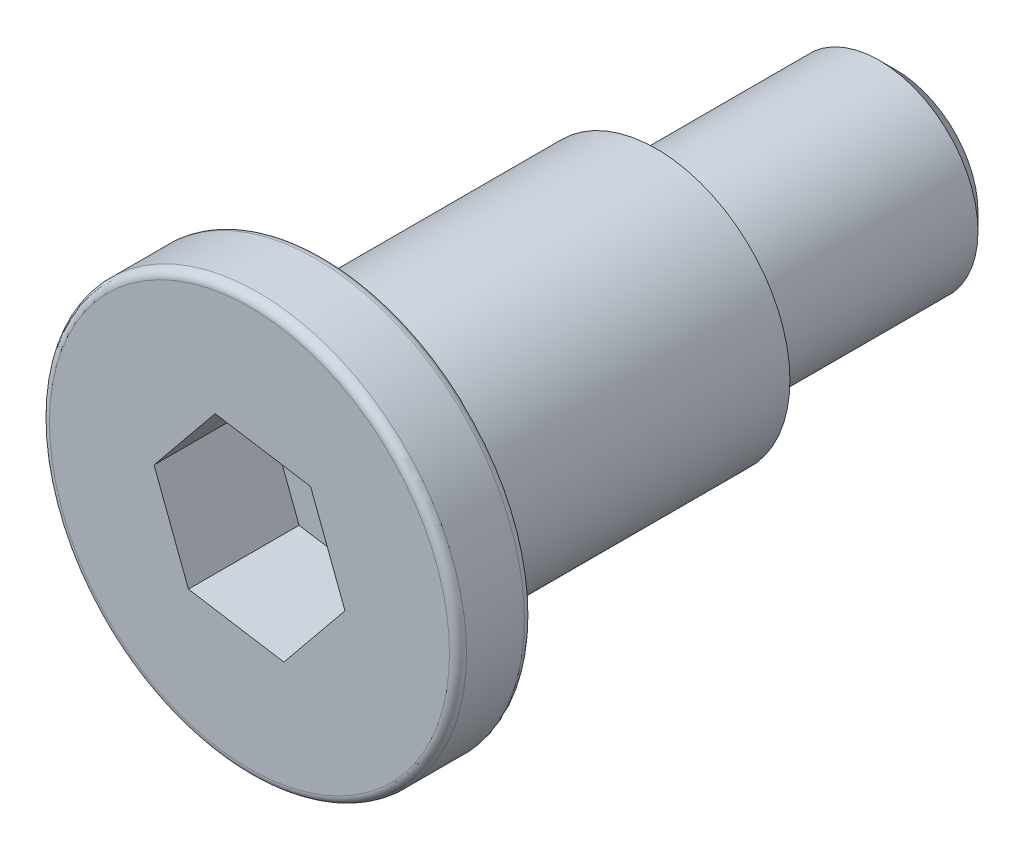
ISO-10303-21;
HEADER;
FILE_DESCRIPTION(('STEP AP214'),'2;1');
FILE_NAME('part.step','',(''),(''),'','','');
FILE_SCHEMA(('AUTOMOTIVE_DESIGN { 1 0 10303 214 1 1 1 1 }'));
ENDSEC;
DATA;
#1=APPLICATION_CONTEXT('core data for automotive mechanical design processes');
#2=APPLICATION_PROTOCOL_DEFINITION('international standard','automotive_design',2000,#1);
#3=PRODUCT_CONTEXT('',#1,'mechanical');
#4=PRODUCT('Part','Part','',(#3));
#5=PRODUCT_RELATED_PRODUCT_CATEGORY('part','',(#4));
#6=PRODUCT_DEFINITION_FORMATION('','',#4);
#7=PRODUCT_DEFINITION_CONTEXT('part definition',#1,'design');
#8=PRODUCT_DEFINITION('design','',#6,#7);
#9=PRODUCT_DEFINITION_SHAPE('','',#8);
#10=(LENGTH_UNIT() NAMED_UNIT(*) SI_UNIT(.MILLI.,.METRE.));
#11=(NAMED_UNIT(*) PLANE_ANGLE_UNIT() SI_UNIT($,.RADIAN.));
#12=(NAMED_UNIT(*) SI_UNIT($,.STERADIAN.) SOLID_ANGLE_UNIT());
#13=UNCERTAINTY_MEASURE_WITH_UNIT(LENGTH_MEASURE(1.E-05),#10,'distance_accuracy_value','');
#14=(GEOMETRIC_REPRESENTATION_CONTEXT(3) GLOBAL_UNCERTAINTY_ASSIGNED_CONTEXT((#13)) GLOBAL_UNIT_ASSIGNED_CONTEXT((#10,
#11,#12)) REPRESENTATION_CONTEXT('',''));
#15=CARTESIAN_POINT('',(0.,0.,0.));
#16=DIRECTION('',(0.,0.,1.));
#17=DIRECTION('',(1.,0.,0.));
#18=AXIS2_PLACEMENT_3D('',#15,#16,#17);
#19=CARTESIAN_POINT('',(0.,1.8669,-1.52591292247407));
#20=DIRECTION('',(0.,0.,-1.));
#21=DIRECTION('',(-1.,0.,0.));
#22=AXIS2_PLACEMENT_3D('',#19,#20,#21);
#23=PLANE('',#22);
#24=CARTESIAN_POINT('',(0.,0.,-1.52591292247407));
#25=DIRECTION('',(0.,0.,-1.));
#26=DIRECTION('',(-1.,0.,0.));
#27=AXIS2_PLACEMENT_3D('',#24,#25,#26);
#28=CIRCLE('',#27,1.7907);
#29=CARTESIAN_POINT('',(-1.7907,0.,-1.52591292247407));
#30=VERTEX_POINT('',#29);
#31=EDGE_CURVE('E160',#30,#30,#28,.F.);
#32=ORIENTED_EDGE('',*,*,#31,.T.);
#33=EDGE_LOOP('',(#32));
#34=FACE_BOUND('',#33,.T.);
#35=DIRECTION('',(0.987209666941548,-0.159427329831364,0.));
#36=VECTOR('',#35,1.);
#37=CARTESIAN_POINT('',(-0.546904779115422,-0.671201319823438,-1.52591292247407));
#38=LINE('',#37,#36);
#39=CARTESIAN_POINT('',(-0.546904779115422,-0.671201319823437,-1.52591292247407));
#40=VERTEX_POINT('',#39);
#41=CARTESIAN_POINT('',(0.30782500446303,-0.809234092076791,-1.52591292247407));
#42=VERTEX_POINT('',#41);
#43=EDGE_CURVE('E124',#40,#42,#38,.T.);
#44=ORIENTED_EDGE('',*,*,#43,.F.);
#45=DIRECTION('',(0.355536715779292,-0.934662315348637,0.));
#46=VECTOR('',#45,1.);
#47=CARTESIAN_POINT('',(-0.854729783578451,0.138032772253354,-1.52591292247407));
#48=LINE('',#47,#46);
#49=CARTESIAN_POINT('',(-0.854729783578451,0.138032772253354,-1.52591292247407));
#50=VERTEX_POINT('',#49);
#51=EDGE_CURVE('E50',#50,#40,#48,.T.);
#52=ORIENTED_EDGE('',*,*,#51,.F.);
#53=DIRECTION('',(-0.631672951162255,-0.775234985517273,0.));
#54=VECTOR('',#53,1.);
#55=CARTESIAN_POINT('',(-0.30782500446303,0.809234092076791,-1.52591292247407));
#56=LINE('',#55,#54);
#57=CARTESIAN_POINT('',(-0.30782500446303,0.809234092076791,-1.52591292247407));
#58=VERTEX_POINT('',#57);
#59=EDGE_CURVE('E133',#58,#50,#56,.T.);
#60=ORIENTED_EDGE('',*,*,#59,.F.);
#61=DIRECTION('',(-0.987209666941548,0.159427329831364,0.));
#62=VECTOR('',#61,1.);
#63=CARTESIAN_POINT('',(0.546904779115422,0.671201319823438,-1.52591292247407));
#64=LINE('',#63,#62);
#65=CARTESIAN_POINT('',(0.546904779115422,0.671201319823438,-1.52591292247407));
#66=VERTEX_POINT('',#65);
#67=EDGE_CURVE('E131',#66,#58,#64,.T.);
#68=ORIENTED_EDGE('',*,*,#67,.F.);
#69=DIRECTION('',(-0.355536715779292,0.934662315348637,0.));
#70=VECTOR('',#69,1.);
#71=CARTESIAN_POINT('',(0.854729783578452,-0.138032772253354,-1.52591292247407));
#72=LINE('',#71,#70);
#73=CARTESIAN_POINT('',(0.854729783578452,-0.138032772253354,-1.52591292247407));
#74=VERTEX_POINT('',#73);
#75=EDGE_CURVE('E98',#74,#66,#72,.T.);
#76=ORIENTED_EDGE('',*,*,#75,.F.);
#77=DIRECTION('',(0.631672951162256,0.775234985517273,0.));
#78=VECTOR('',#77,1.);
#79=CARTESIAN_POINT('',(0.30782500446303,-0.809234092076791,-1.52591292247407));
#80=LINE('',#79,#78);
#81=EDGE_CURVE('E127',#42,#74,#80,.T.);
#82=ORIENTED_EDGE('',*,*,#81,.F.);
#83=EDGE_LOOP('',(#44,#52,#60,#68,#76,#82));
#84=FACE_BOUND('',#83,.T.);
#85=ADVANCED_FACE('F35',(#34,#84),#23,.F.);
#86=CARTESIAN_POINT('',(0.,0.,-7.31711292247407));
#87=DIRECTION('',(0.,0.,1.));
#88=DIRECTION('',(1.,0.,0.));
#89=AXIS2_PLACEMENT_3D('',#86,#87,#88);
#90=PLANE('',#89);
#91=CARTESIAN_POINT('',(0.,0.,-7.31711292247407));
#92=DIRECTION('',(0.,0.,1.));
#93=DIRECTION('',(1.,0.,0.));
#94=AXIS2_PLACEMENT_3D('',#91,#92,#93);
#95=CIRCLE('',#94,0.731519999999999);
#96=CARTESIAN_POINT('',(0.731519999999999,0.,-7.31711292247407));
#97=VERTEX_POINT('',#96);
#98=EDGE_CURVE('E11',#97,#97,#95,.F.);
#99=ORIENTED_EDGE('',*,*,#98,.T.);
#100=EDGE_LOOP('',(#99));
#101=FACE_BOUND('',#100,.T.);
#102=ADVANCED_FACE('F178',(#101),#90,.F.);
#103=CARTESIAN_POINT('',(0.,0.,-1.52591292247407));
#104=DIRECTION('',(0.,0.,1.));
#105=DIRECTION('',(1.,0.,0.));
#106=AXIS2_PLACEMENT_3D('',#103,#104,#105);
#107=CYLINDRICAL_SURFACE('',#106,0.88392);
#108=CARTESIAN_POINT('',(0.,0.,-7.16471292247407));
#109=DIRECTION('',(0.,0.,1.));
#110=DIRECTION('',(1.,0.,0.));
#111=AXIS2_PLACEMENT_3D('',#108,#109,#110);
#112=CIRCLE('',#111,0.88392);
#113=CARTESIAN_POINT('',(0.88392,0.,-7.16471292247407));
#114=VERTEX_POINT('',#113);
#115=EDGE_CURVE('E43',#114,#114,#112,.T.);
#116=ORIENTED_EDGE('',*,*,#115,.T.);
#117=EDGE_LOOP('',(#116));
#118=FACE_BOUND('',#117,.T.);
#119=CARTESIAN_POINT('',(0.,0.,-5.16827292247407));
#120=DIRECTION('',(0.,0.,1.));
#121=DIRECTION('',(1.,0.,0.));
#122=AXIS2_PLACEMENT_3D('',#119,#120,#121);
#123=CIRCLE('',#122,0.88392);
#124=CARTESIAN_POINT('',(0.88392,0.,-5.16827292247407));
#125=VERTEX_POINT('',#124);
#126=EDGE_CURVE('E148',#125,#125,#123,.T.);
#127=ORIENTED_EDGE('',*,*,#126,.F.);
#128=EDGE_LOOP('',(#127));
#129=FACE_BOUND('',#128,.T.);
#130=ADVANCED_FACE('F165',(#118,#129),#107,.T.);
#131=CARTESIAN_POINT('',(0.,0.88392,-5.16827292247407));
#132=DIRECTION('',(0.,0.,1.));
#133=DIRECTION('',(1.,0.,0.));
#134=AXIS2_PLACEMENT_3D('',#131,#132,#133);
#135=PLANE('',#134);
#136=CARTESIAN_POINT('',(0.,0.,-5.16827292247407));
#137=DIRECTION('',(0.,0.,1.));
#138=DIRECTION('',(1.,0.,0.));
#139=AXIS2_PLACEMENT_3D('',#136,#137,#138);
#140=CIRCLE('',#139,1.19634);
#141=CARTESIAN_POINT('',(1.19634,0.,-5.16827292247407));
#142=VERTEX_POINT('',#141);
#143=EDGE_CURVE('E145',#142,#142,#140,.T.);
#144=ORIENTED_EDGE('',*,*,#143,.F.);
#145=EDGE_LOOP('',(#144));
#146=FACE_BOUND('',#145,.T.);
#147=ORIENTED_EDGE('',*,*,#126,.T.);
#148=EDGE_LOOP('',(#147));
#149=FACE_BOUND('',#148,.T.);
#150=ADVANCED_FACE('F222',(#146,#149),#135,.F.);
#151=CARTESIAN_POINT('',(0.,0.,-1.52591292247407));
#152=DIRECTION('',(0.,0.,1.));
#153=DIRECTION('',(1.,0.,0.));
#154=AXIS2_PLACEMENT_3D('',#151,#152,#153);
#155=CYLINDRICAL_SURFACE('',#154,1.19634);
#156=CARTESIAN_POINT('',(0.,0.,-2.19647292247407));
#157=DIRECTION('',(0.,0.,1.));
#158=DIRECTION('',(1.,0.,0.));
#159=AXIS2_PLACEMENT_3D('',#156,#157,#158);
#160=CIRCLE('',#159,1.19634);
#161=CARTESIAN_POINT('',(1.19634,0.,-2.19647292247407));
#162=VERTEX_POINT('',#161);
#163=EDGE_CURVE('E137',#162,#162,#160,.T.);
#164=ORIENTED_EDGE('',*,*,#163,.F.);
#165=EDGE_LOOP('',(#164));
#166=FACE_BOUND('',#165,.T.);
#167=ORIENTED_EDGE('',*,*,#143,.T.);
#168=EDGE_LOOP('',(#167));
#169=FACE_BOUND('',#168,.T.);
#170=ADVANCED_FACE('F215',(#166,#169),#155,.T.);
#171=CARTESIAN_POINT('',(0.,1.19634,-2.19647292247407));
#172=DIRECTION('',(0.,0.,1.));
#173=DIRECTION('',(1.,0.,0.));
#174=AXIS2_PLACEMENT_3D('',#171,#172,#173);
#175=PLANE('',#174);
#176=CARTESIAN_POINT('',(0.,0.,-2.19647292247407));
#177=DIRECTION('',(0.,0.,1.));
#178=DIRECTION('',(1.,0.,0.));
#179=AXIS2_PLACEMENT_3D('',#176,#177,#178);
#180=CIRCLE('',#179,1.7907);
#181=CARTESIAN_POINT('',(1.7907,0.,-2.19647292247407));
#182=VERTEX_POINT('',#181);
#183=EDGE_CURVE('E157',#182,#182,#180,.F.);
#184=ORIENTED_EDGE('',*,*,#183,.T.);
#185=EDGE_LOOP('',(#184));
#186=FACE_BOUND('',#185,.T.);
#187=ORIENTED_EDGE('',*,*,#163,.T.);
#188=EDGE_LOOP('',(#187));
#189=FACE_BOUND('',#188,.T.);
#190=ADVANCED_FACE('F204',(#186,#189),#175,.F.);
#191=CARTESIAN_POINT('',(0.,0.,-1.52591292247407));
#192=DIRECTION('',(0.,0.,1.));
#193=DIRECTION('',(1.,0.,0.));
#194=AXIS2_PLACEMENT_3D('',#191,#192,#193);
#195=CYLINDRICAL_SURFACE('',#194,1.8669);
#196=CARTESIAN_POINT('',(0.,0.,-2.12027292247407));
#197=DIRECTION('',(0.,0.,1.));
#198=DIRECTION('',(1.,0.,0.));
#199=AXIS2_PLACEMENT_3D('',#196,#197,#198);
#200=CIRCLE('',#199,1.8669);
#201=CARTESIAN_POINT('',(1.8669,0.,-2.12027292247407));
#202=VERTEX_POINT('',#201);
#203=EDGE_CURVE('E154',#202,#202,#200,.T.);
#204=ORIENTED_EDGE('',*,*,#203,.T.);
#205=EDGE_LOOP('',(#204));
#206=FACE_BOUND('',#205,.T.);
#207=CARTESIAN_POINT('',(0.,0.,-1.60211292247407));
#208=DIRECTION('',(0.,0.,-1.));
#209=DIRECTION('',(-1.,0.,0.));
#210=AXIS2_PLACEMENT_3D('',#207,#208,#209);
#211=CIRCLE('',#210,1.8669);
#212=CARTESIAN_POINT('',(-1.8669,0.,-1.60211292247407));
#213=VERTEX_POINT('',#212);
#214=EDGE_CURVE('E151',#213,#213,#211,.T.);
#215=ORIENTED_EDGE('',*,*,#214,.T.);
#216=EDGE_LOOP('',(#215));
#217=FACE_BOUND('',#216,.T.);
#218=ADVANCED_FACE('F200',(#206,#217),#195,.T.);
#219=CARTESIAN_POINT('',(-0.854729783578451,0.138032772253354,-2.51651292247407));
#220=DIRECTION('',(-0.934662315348637,-0.355536715779292,0.));
#221=DIRECTION('',(0.355536715779292,-0.934662315348637,0.));
#222=AXIS2_PLACEMENT_3D('',#219,#220,#221);
#223=PLANE('',#222);
#224=ORIENTED_EDGE('',*,*,#51,.T.);
#225=DIRECTION('',(0.,0.,1.));
#226=VECTOR('',#225,1.);
#227=CARTESIAN_POINT('',(-0.546904779115422,-0.671201319823438,-2.51651292247407));
#228=LINE('',#227,#226);
#229=CARTESIAN_POINT('',(-0.546904779115422,-0.671201319823438,-2.51651292247407));
#230=VERTEX_POINT('',#229);
#231=EDGE_CURVE('E80',#230,#40,#228,.T.);
#232=ORIENTED_EDGE('',*,*,#231,.F.);
#233=DIRECTION('',(0.355536715779292,-0.934662315348637,0.));
#234=VECTOR('',#233,1.);
#235=CARTESIAN_POINT('',(-0.854729783578451,0.138032772253354,-2.51651292247407));
#236=LINE('',#235,#234);
#237=CARTESIAN_POINT('',(-0.854729783578451,0.138032772253354,-2.51651292247407));
#238=VERTEX_POINT('',#237);
#239=EDGE_CURVE('E135',#238,#230,#236,.T.);
#240=ORIENTED_EDGE('',*,*,#239,.F.);
#241=DIRECTION('',(0.,0.,1.));
#242=VECTOR('',#241,1.);
#243=CARTESIAN_POINT('',(-0.854729783578451,0.138032772253354,-2.51651292247407));
#244=LINE('',#243,#242);
#245=EDGE_CURVE('E58',#238,#50,#244,.T.);
#246=ORIENTED_EDGE('',*,*,#245,.T.);
#247=EDGE_LOOP('',(#224,#232,#240,#246));
#248=FACE_BOUND('',#247,.T.);
#249=ADVANCED_FACE('F203',(#248),#223,.F.);
#250=CARTESIAN_POINT('',(-0.30782500446303,0.809234092076791,-2.51651292247407));
#251=DIRECTION('',(-0.775234985517273,0.631672951162255,0.));
#252=DIRECTION('',(-0.631672951162255,-0.775234985517273,0.));
#253=AXIS2_PLACEMENT_3D('',#250,#251,#252);
#254=PLANE('',#253);
#255=ORIENTED_EDGE('',*,*,#59,.T.);
#256=ORIENTED_EDGE('',*,*,#245,.F.);
#257=DIRECTION('',(-0.631672951162255,-0.775234985517273,0.));
#258=VECTOR('',#257,1.);
#259=CARTESIAN_POINT('',(-0.30782500446303,0.809234092076791,-2.51651292247407));
#260=LINE('',#259,#258);
#261=CARTESIAN_POINT('',(-0.30782500446303,0.809234092076791,-2.51651292247407));
#262=VERTEX_POINT('',#261);
#263=EDGE_CURVE('E110',#262,#238,#260,.T.);
#264=ORIENTED_EDGE('',*,*,#263,.F.);
#265=DIRECTION('',(0.,0.,1.));
#266=VECTOR('',#265,1.);
#267=CARTESIAN_POINT('',(-0.30782500446303,0.809234092076791,-2.51651292247407));
#268=LINE('',#267,#266);
#269=EDGE_CURVE('E102',#262,#58,#268,.T.);
#270=ORIENTED_EDGE('',*,*,#269,.T.);
#271=EDGE_LOOP('',(#255,#256,#264,#270));
#272=FACE_BOUND('',#271,.T.);
#273=ADVANCED_FACE('F213',(#272),#254,.F.);
#274=CARTESIAN_POINT('',(0.546904779115422,0.671201319823438,-2.51651292247407));
#275=DIRECTION('',(0.159427329831364,0.987209666941548,0.));
#276=DIRECTION('',(-0.987209666941548,0.159427329831364,0.));
#277=AXIS2_PLACEMENT_3D('',#274,#275,#276);
#278=PLANE('',#277);
#279=ORIENTED_EDGE('',*,*,#67,.T.);
#280=ORIENTED_EDGE('',*,*,#269,.F.);
#281=DIRECTION('',(-0.987209666941548,0.159427329831364,0.));
#282=VECTOR('',#281,1.);
#283=CARTESIAN_POINT('',(0.546904779115422,0.671201319823438,-2.51651292247407));
#284=LINE('',#283,#282);
#285=CARTESIAN_POINT('',(0.546904779115422,0.671201319823438,-2.51651292247407));
#286=VERTEX_POINT('',#285);
#287=EDGE_CURVE('E106',#286,#262,#284,.T.);
#288=ORIENTED_EDGE('',*,*,#287,.F.);
#289=DIRECTION('',(0.,0.,1.));
#290=VECTOR('',#289,1.);
#291=CARTESIAN_POINT('',(0.546904779115422,0.671201319823438,-2.51651292247407));
#292=LINE('',#291,#290);
#293=EDGE_CURVE('E91',#286,#66,#292,.T.);
#294=ORIENTED_EDGE('',*,*,#293,.T.);
#295=EDGE_LOOP('',(#279,#280,#288,#294));
#296=FACE_BOUND('',#295,.T.);
#297=ADVANCED_FACE('F107',(#296),#278,.F.);
#298=CARTESIAN_POINT('',(0.854729783578452,-0.138032772253354,-2.51651292247407));
#299=DIRECTION('',(0.934662315348637,0.355536715779292,0.));
#300=DIRECTION('',(-0.355536715779292,0.934662315348637,0.));
#301=AXIS2_PLACEMENT_3D('',#298,#299,#300);
#302=PLANE('',#301);
#303=ORIENTED_EDGE('',*,*,#75,.T.);
#304=ORIENTED_EDGE('',*,*,#293,.F.);
#305=DIRECTION('',(-0.355536715779292,0.934662315348637,0.));
#306=VECTOR('',#305,1.);
#307=CARTESIAN_POINT('',(0.854729783578452,-0.138032772253354,-2.51651292247407));
#308=LINE('',#307,#306);
#309=CARTESIAN_POINT('',(0.854729783578452,-0.138032772253354,-2.51651292247407));
#310=VERTEX_POINT('',#309);
#311=EDGE_CURVE('E95',#310,#286,#308,.T.);
#312=ORIENTED_EDGE('',*,*,#311,.F.);
#313=DIRECTION('',(0.,0.,1.));
#314=VECTOR('',#313,1.);
#315=CARTESIAN_POINT('',(0.854729783578452,-0.138032772253354,-2.51651292247407));
#316=LINE('',#315,#314);
#317=EDGE_CURVE('E103',#310,#74,#316,.T.);
#318=ORIENTED_EDGE('',*,*,#317,.T.);
#319=EDGE_LOOP('',(#303,#304,#312,#318));
#320=FACE_BOUND('',#319,.T.);
#321=ADVANCED_FACE('F93',(#320),#302,.F.);
#322=CARTESIAN_POINT('',(0.30782500446303,-0.809234092076791,-2.51651292247407));
#323=DIRECTION('',(0.775234985517273,-0.631672951162256,0.));
#324=DIRECTION('',(0.631672951162256,0.775234985517273,0.));
#325=AXIS2_PLACEMENT_3D('',#322,#323,#324);
#326=PLANE('',#325);
#327=ORIENTED_EDGE('',*,*,#81,.T.);
#328=ORIENTED_EDGE('',*,*,#317,.F.);
#329=DIRECTION('',(0.631672951162256,0.775234985517273,0.));
#330=VECTOR('',#329,1.);
#331=CARTESIAN_POINT('',(0.30782500446303,-0.809234092076791,-2.51651292247407));
#332=LINE('',#331,#330);
#333=CARTESIAN_POINT('',(0.30782500446303,-0.809234092076791,-2.51651292247407));
#334=VERTEX_POINT('',#333);
#335=EDGE_CURVE('E116',#334,#310,#332,.T.);
#336=ORIENTED_EDGE('',*,*,#335,.F.);
#337=DIRECTION('',(0.,0.,1.));
#338=VECTOR('',#337,1.);
#339=CARTESIAN_POINT('',(0.30782500446303,-0.809234092076791,-2.51651292247407));
#340=LINE('',#339,#338);
#341=EDGE_CURVE('E140',#334,#42,#340,.T.);
#342=ORIENTED_EDGE('',*,*,#341,.T.);
#343=EDGE_LOOP('',(#327,#328,#336,#342));
#344=FACE_BOUND('',#343,.T.);
#345=ADVANCED_FACE('F278',(#344),#326,.F.);
#346=CARTESIAN_POINT('',(-0.546904779115422,-0.671201319823438,-2.51651292247407));
#347=DIRECTION('',(-0.159427329831364,-0.987209666941548,0.));
#348=DIRECTION('',(0.987209666941548,-0.159427329831364,0.));
#349=AXIS2_PLACEMENT_3D('',#346,#347,#348);
#350=PLANE('',#349);
#351=ORIENTED_EDGE('',*,*,#43,.T.);
#352=ORIENTED_EDGE('',*,*,#341,.F.);
#353=DIRECTION('',(0.987209666941548,-0.159427329831364,0.));
#354=VECTOR('',#353,1.);
#355=CARTESIAN_POINT('',(-0.546904779115422,-0.671201319823438,-2.51651292247407));
#356=LINE('',#355,#354);
#357=EDGE_CURVE('E118',#230,#334,#356,.T.);
#358=ORIENTED_EDGE('',*,*,#357,.F.);
#359=ORIENTED_EDGE('',*,*,#231,.T.);
#360=EDGE_LOOP('',(#351,#352,#358,#359));
#361=FACE_BOUND('',#360,.T.);
#362=ADVANCED_FACE('F194',(#361),#350,.F.);
#363=CARTESIAN_POINT('',(0.,0.,-2.51651292247407));
#364=DIRECTION('',(0.,0.,1.));
#365=DIRECTION('',(1.,0.,0.));
#366=AXIS2_PLACEMENT_3D('',#363,#364,#365);
#367=PLANE('',#366);
#368=ORIENTED_EDGE('',*,*,#239,.T.);
#369=ORIENTED_EDGE('',*,*,#357,.T.);
#370=ORIENTED_EDGE('',*,*,#335,.T.);
#371=ORIENTED_EDGE('',*,*,#311,.T.);
#372=ORIENTED_EDGE('',*,*,#287,.T.);
#373=ORIENTED_EDGE('',*,*,#263,.T.);
#374=EDGE_LOOP('',(#368,#369,#370,#371,#372,#373));
#375=FACE_BOUND('',#374,.T.);
#376=ADVANCED_FACE('F113',(#375),#367,.T.);
#377=CARTESIAN_POINT('',(0.,0.,-2.12027292247407));
#378=DIRECTION('',(0.,0.,1.));
#379=DIRECTION('',(1.,0.,0.));
#380=AXIS2_PLACEMENT_3D('',#377,#378,#379);
#381=TOROIDAL_SURFACE('',#380,1.7907,0.0762);
#382=ORIENTED_EDGE('',*,*,#183,.F.);
#383=EDGE_LOOP('',(#382));
#384=FACE_BOUND('',#383,.T.);
#385=ORIENTED_EDGE('',*,*,#203,.F.);
#386=EDGE_LOOP('',(#385));
#387=FACE_BOUND('',#386,.T.);
#388=ADVANCED_FACE('F174',(#384,#387),#381,.T.);
#389=CARTESIAN_POINT('',(0.,0.,-1.60211292247407));
#390=DIRECTION('',(0.,0.,-1.));
#391=DIRECTION('',(-1.,0.,0.));
#392=AXIS2_PLACEMENT_3D('',#389,#390,#391);
#393=TOROIDAL_SURFACE('',#392,1.7907,0.0762);
#394=ORIENTED_EDGE('',*,*,#214,.F.);
#395=EDGE_LOOP('',(#394));
#396=FACE_BOUND('',#395,.T.);
#397=ORIENTED_EDGE('',*,*,#31,.F.);
#398=EDGE_LOOP('',(#397));
#399=FACE_BOUND('',#398,.T.);
#400=ADVANCED_FACE('F169',(#396,#399),#393,.T.);
#401=CARTESIAN_POINT('',(0.,0.,-7.16471292247407));
#402=DIRECTION('',(0.,0.,1.));
#403=DIRECTION('',(1.,0.,0.));
#404=AXIS2_PLACEMENT_3D('',#401,#402,#403);
#405=CONICAL_SURFACE('',#404,0.88392,0.785398163397457);
#406=ORIENTED_EDGE('',*,*,#98,.F.);
#407=EDGE_LOOP('',(#406));
#408=FACE_BOUND('',#407,.T.);
#409=ORIENTED_EDGE('',*,*,#115,.F.);
#410=EDGE_LOOP('',(#409));
#411=FACE_BOUND('',#410,.T.);
#412=ADVANCED_FACE('F37',(#408,#411),#405,.T.);
#413=CLOSED_SHELL('',(#85,#102,#130,#150,#170,#190,#218,#249,#273,#297,#321,#345,#362,#376,#388,
#400,#412));
#414=MANIFOLD_SOLID_BREP('B2',#413);
#415=ADVANCED_BREP_SHAPE_REPRESENTATION('',(#18,#414),#14);
#416=SHAPE_DEFINITION_REPRESENTATION(#9,#415);
ENDSEC;
END-ISO-10303-21;
